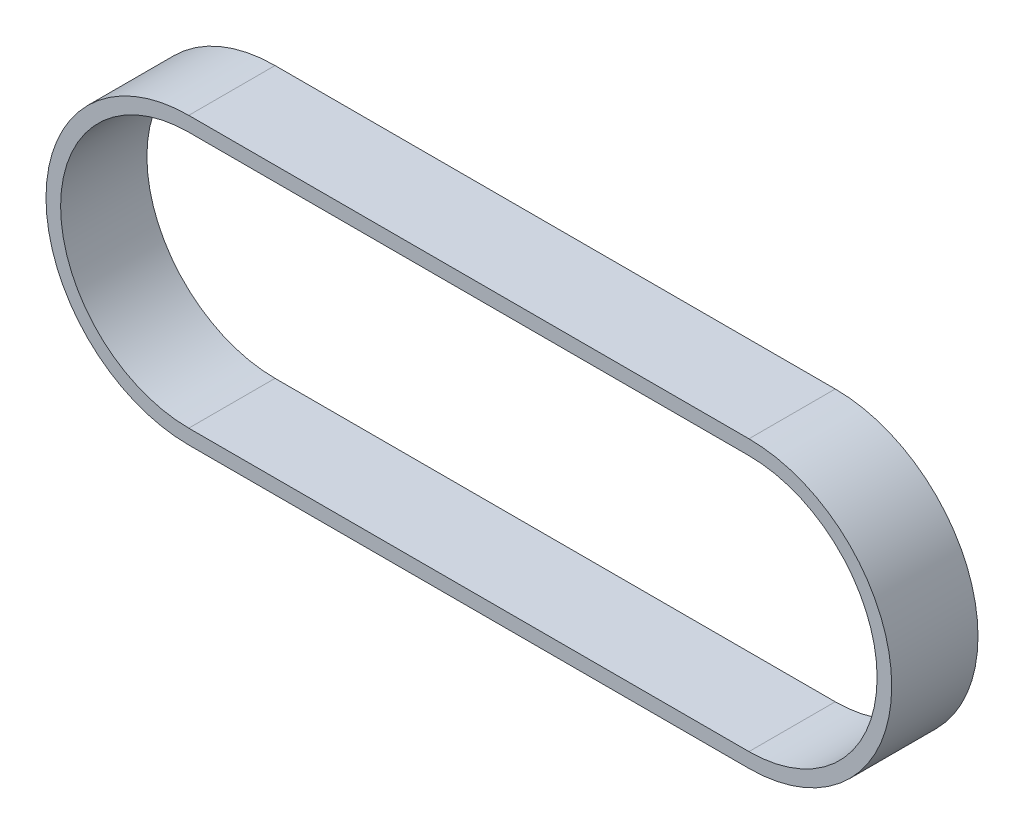
ISO-10303-21;
HEADER;
FILE_DESCRIPTION(('STEP AP214'),'2;1');
FILE_NAME('part.step','',(''),(''),'','','');
FILE_SCHEMA(('AUTOMOTIVE_DESIGN { 1 0 10303 214 1 1 1 1 }'));
ENDSEC;
DATA;
#1=APPLICATION_CONTEXT('core data for automotive mechanical design processes');
#2=APPLICATION_PROTOCOL_DEFINITION('international standard','automotive_design',2000,#1);
#3=PRODUCT_CONTEXT('',#1,'mechanical');
#4=PRODUCT('Part','Part','',(#3));
#5=PRODUCT_RELATED_PRODUCT_CATEGORY('part','',(#4));
#6=PRODUCT_DEFINITION_FORMATION('','',#4);
#7=PRODUCT_DEFINITION_CONTEXT('part definition',#1,'design');
#8=PRODUCT_DEFINITION('design','',#6,#7);
#9=PRODUCT_DEFINITION_SHAPE('','',#8);
#10=(LENGTH_UNIT() NAMED_UNIT(*) SI_UNIT(.MILLI.,.METRE.));
#11=(NAMED_UNIT(*) PLANE_ANGLE_UNIT() SI_UNIT($,.RADIAN.));
#12=(NAMED_UNIT(*) SI_UNIT($,.STERADIAN.) SOLID_ANGLE_UNIT());
#13=UNCERTAINTY_MEASURE_WITH_UNIT(LENGTH_MEASURE(1.E-05),#10,'distance_accuracy_value','');
#14=(GEOMETRIC_REPRESENTATION_CONTEXT(3) GLOBAL_UNCERTAINTY_ASSIGNED_CONTEXT((#13)) GLOBAL_UNIT_ASSIGNED_CONTEXT((#10,
#11,#12)) REPRESENTATION_CONTEXT('',''));
#15=CARTESIAN_POINT('',(0.,0.,0.));
#16=DIRECTION('',(0.,0.,1.));
#17=DIRECTION('',(1.,0.,0.));
#18=AXIS2_PLACEMENT_3D('',#15,#16,#17);
#19=CARTESIAN_POINT('',(0.,0.,15.));
#20=DIRECTION('',(0.,0.,-1.));
#21=DIRECTION('',(-1.,0.,0.));
#22=AXIS2_PLACEMENT_3D('',#19,#20,#21);
#23=PLANE('',#22);
#24=CARTESIAN_POINT('',(0.,0.,15.));
#25=DIRECTION('',(0.,0.,1.));
#26=DIRECTION('',(-1.,0.,0.));
#27=AXIS2_PLACEMENT_3D('',#24,#25,#26);
#28=CIRCLE('',#27,24.8158);
#29=CARTESIAN_POINT('',(0.,24.8158,15.));
#30=VERTEX_POINT('',#29);
#31=CARTESIAN_POINT('',(0.,-24.8158,15.));
#32=VERTEX_POINT('',#31);
#33=EDGE_CURVE('E142',#30,#32,#28,.T.);
#34=ORIENTED_EDGE('',*,*,#33,.T.);
#35=DIRECTION('',(1.,0.,0.));
#36=VECTOR('',#35,1.);
#37=CARTESIAN_POINT('',(97.3836,-24.8158,15.));
#38=LINE('',#37,#36);
#39=CARTESIAN_POINT('',(97.3836,-24.8158,15.));
#40=VERTEX_POINT('',#39);
#41=EDGE_CURVE('E145',#32,#40,#38,.T.);
#42=ORIENTED_EDGE('',*,*,#41,.T.);
#43=CARTESIAN_POINT('',(97.3836,0.,15.));
#44=DIRECTION('',(0.,0.,1.));
#45=DIRECTION('',(1.,0.,0.));
#46=AXIS2_PLACEMENT_3D('',#43,#44,#45);
#47=CIRCLE('',#46,24.8158);
#48=CARTESIAN_POINT('',(97.3836,24.8158,15.));
#49=VERTEX_POINT('',#48);
#50=EDGE_CURVE('E148',#40,#49,#47,.T.);
#51=ORIENTED_EDGE('',*,*,#50,.T.);
#52=DIRECTION('',(-1.,0.,0.));
#53=VECTOR('',#52,1.);
#54=CARTESIAN_POINT('',(0.,24.8158,15.));
#55=LINE('',#54,#53);
#56=EDGE_CURVE('E150',#49,#30,#55,.T.);
#57=ORIENTED_EDGE('',*,*,#56,.T.);
#58=EDGE_LOOP('',(#34,#42,#51,#57));
#59=FACE_BOUND('',#58,.T.);
#60=CARTESIAN_POINT('',(0.,0.,15.));
#61=DIRECTION('',(0.,0.,1.));
#62=DIRECTION('',(-1.,0.,0.));
#63=AXIS2_PLACEMENT_3D('',#60,#61,#62);
#64=CIRCLE('',#63,22.2758);
#65=CARTESIAN_POINT('',(0.,22.2758,15.));
#66=VERTEX_POINT('',#65);
#67=CARTESIAN_POINT('',(0.,-22.2758,15.));
#68=VERTEX_POINT('',#67);
#69=EDGE_CURVE('E106',#66,#68,#64,.T.);
#70=ORIENTED_EDGE('',*,*,#69,.F.);
#71=DIRECTION('',(-1.,0.,0.));
#72=VECTOR('',#71,1.);
#73=CARTESIAN_POINT('',(0.,22.2758,15.));
#74=LINE('',#73,#72);
#75=CARTESIAN_POINT('',(97.3836,22.2758,15.));
#76=VERTEX_POINT('',#75);
#77=EDGE_CURVE('E128',#76,#66,#74,.T.);
#78=ORIENTED_EDGE('',*,*,#77,.F.);
#79=CARTESIAN_POINT('',(97.3836,0.,15.));
#80=DIRECTION('',(0.,0.,1.));
#81=DIRECTION('',(1.,0.,0.));
#82=AXIS2_PLACEMENT_3D('',#79,#80,#81);
#83=CIRCLE('',#82,22.2758);
#84=CARTESIAN_POINT('',(97.3836,-22.2758,15.));
#85=VERTEX_POINT('',#84);
#86=EDGE_CURVE('E126',#85,#76,#83,.T.);
#87=ORIENTED_EDGE('',*,*,#86,.F.);
#88=DIRECTION('',(1.,0.,0.));
#89=VECTOR('',#88,1.);
#90=CARTESIAN_POINT('',(97.3836,-22.2758,15.));
#91=LINE('',#90,#89);
#92=EDGE_CURVE('E114',#68,#85,#91,.T.);
#93=ORIENTED_EDGE('',*,*,#92,.F.);
#94=EDGE_LOOP('',(#70,#78,#87,#93));
#95=FACE_BOUND('',#94,.T.);
#96=ADVANCED_FACE('F41',(#59,#95),#23,.F.);
#97=CARTESIAN_POINT('',(0.,0.,0.));
#98=DIRECTION('',(0.,0.,-1.));
#99=DIRECTION('',(-1.,0.,0.));
#100=AXIS2_PLACEMENT_3D('',#97,#98,#99);
#101=PLANE('',#100);
#102=CARTESIAN_POINT('',(0.,0.,0.));
#103=DIRECTION('',(0.,0.,1.));
#104=DIRECTION('',(-1.,0.,0.));
#105=AXIS2_PLACEMENT_3D('',#102,#103,#104);
#106=CIRCLE('',#105,24.8158);
#107=CARTESIAN_POINT('',(0.,24.8158,0.));
#108=VERTEX_POINT('',#107);
#109=CARTESIAN_POINT('',(0.,-24.8158,0.));
#110=VERTEX_POINT('',#109);
#111=EDGE_CURVE('E122',#108,#110,#106,.T.);
#112=ORIENTED_EDGE('',*,*,#111,.F.);
#113=DIRECTION('',(-1.,0.,0.));
#114=VECTOR('',#113,1.);
#115=CARTESIAN_POINT('',(0.,24.8158,0.));
#116=LINE('',#115,#114);
#117=CARTESIAN_POINT('',(97.3836,24.8158,0.));
#118=VERTEX_POINT('',#117);
#119=EDGE_CURVE('E146',#118,#108,#116,.T.);
#120=ORIENTED_EDGE('',*,*,#119,.F.);
#121=CARTESIAN_POINT('',(97.3836,0.,0.));
#122=DIRECTION('',(0.,0.,1.));
#123=DIRECTION('',(1.,0.,0.));
#124=AXIS2_PLACEMENT_3D('',#121,#122,#123);
#125=CIRCLE('',#124,24.8158);
#126=CARTESIAN_POINT('',(97.3836,-24.8158,0.));
#127=VERTEX_POINT('',#126);
#128=EDGE_CURVE('E157',#127,#118,#125,.T.);
#129=ORIENTED_EDGE('',*,*,#128,.F.);
#130=DIRECTION('',(1.,0.,0.));
#131=VECTOR('',#130,1.);
#132=CARTESIAN_POINT('',(97.3836,-24.8158,0.));
#133=LINE('',#132,#131);
#134=EDGE_CURVE('E155',#110,#127,#133,.T.);
#135=ORIENTED_EDGE('',*,*,#134,.F.);
#136=EDGE_LOOP('',(#112,#120,#129,#135));
#137=FACE_BOUND('',#136,.T.);
#138=DIRECTION('',(-1.,0.,0.));
#139=VECTOR('',#138,1.);
#140=CARTESIAN_POINT('',(0.,22.2758,0.));
#141=LINE('',#140,#139);
#142=CARTESIAN_POINT('',(97.3836,22.2758,0.));
#143=VERTEX_POINT('',#142);
#144=CARTESIAN_POINT('',(0.,22.2758,0.));
#145=VERTEX_POINT('',#144);
#146=EDGE_CURVE('E115',#143,#145,#141,.T.);
#147=ORIENTED_EDGE('',*,*,#146,.T.);
#148=CARTESIAN_POINT('',(0.,0.,0.));
#149=DIRECTION('',(0.,0.,1.));
#150=DIRECTION('',(-1.,0.,0.));
#151=AXIS2_PLACEMENT_3D('',#148,#149,#150);
#152=CIRCLE('',#151,22.2758);
#153=CARTESIAN_POINT('',(0.,-22.2758,0.));
#154=VERTEX_POINT('',#153);
#155=EDGE_CURVE('E64',#145,#154,#152,.T.);
#156=ORIENTED_EDGE('',*,*,#155,.T.);
#157=DIRECTION('',(1.,0.,0.));
#158=VECTOR('',#157,1.);
#159=CARTESIAN_POINT('',(97.3836,-22.2758,0.));
#160=LINE('',#159,#158);
#161=CARTESIAN_POINT('',(97.3836,-22.2758,0.));
#162=VERTEX_POINT('',#161);
#163=EDGE_CURVE('E121',#154,#162,#160,.T.);
#164=ORIENTED_EDGE('',*,*,#163,.T.);
#165=CARTESIAN_POINT('',(97.3836,0.,0.));
#166=DIRECTION('',(0.,0.,1.));
#167=DIRECTION('',(1.,0.,0.));
#168=AXIS2_PLACEMENT_3D('',#165,#166,#167);
#169=CIRCLE('',#168,22.2758);
#170=EDGE_CURVE('E134',#162,#143,#169,.T.);
#171=ORIENTED_EDGE('',*,*,#170,.T.);
#172=EDGE_LOOP('',(#147,#156,#164,#171));
#173=FACE_BOUND('',#172,.T.);
#174=ADVANCED_FACE('F175',(#137,#173),#101,.T.);
#175=CARTESIAN_POINT('',(0.,0.,15.));
#176=DIRECTION('',(0.,0.,-1.));
#177=DIRECTION('',(-1.,0.,0.));
#178=AXIS2_PLACEMENT_3D('',#175,#176,#177);
#179=CYLINDRICAL_SURFACE('',#178,24.8158);
#180=ORIENTED_EDGE('',*,*,#111,.T.);
#181=DIRECTION('',(0.,0.,-1.));
#182=VECTOR('',#181,1.);
#183=CARTESIAN_POINT('',(0.,-24.8158,15.));
#184=LINE('',#183,#182);
#185=EDGE_CURVE('E11',#32,#110,#184,.T.);
#186=ORIENTED_EDGE('',*,*,#185,.F.);
#187=ORIENTED_EDGE('',*,*,#33,.F.);
#188=DIRECTION('',(0.,0.,-1.));
#189=VECTOR('',#188,1.);
#190=CARTESIAN_POINT('',(0.,24.8158,15.));
#191=LINE('',#190,#189);
#192=EDGE_CURVE('E152',#30,#108,#191,.T.);
#193=ORIENTED_EDGE('',*,*,#192,.T.);
#194=EDGE_LOOP('',(#180,#186,#187,#193));
#195=FACE_BOUND('',#194,.T.);
#196=ADVANCED_FACE('F43',(#195),#179,.T.);
#197=CARTESIAN_POINT('',(97.3836,-24.8158,15.));
#198=DIRECTION('',(0.,1.,0.));
#199=DIRECTION('',(-1.,0.,0.));
#200=AXIS2_PLACEMENT_3D('',#197,#198,#199);
#201=PLANE('',#200);
#202=ORIENTED_EDGE('',*,*,#134,.T.);
#203=DIRECTION('',(0.,0.,-1.));
#204=VECTOR('',#203,1.);
#205=CARTESIAN_POINT('',(97.3836,-24.8158,15.));
#206=LINE('',#205,#204);
#207=EDGE_CURVE('E49',#40,#127,#206,.T.);
#208=ORIENTED_EDGE('',*,*,#207,.F.);
#209=ORIENTED_EDGE('',*,*,#41,.F.);
#210=ORIENTED_EDGE('',*,*,#185,.T.);
#211=EDGE_LOOP('',(#202,#208,#209,#210));
#212=FACE_BOUND('',#211,.T.);
#213=ADVANCED_FACE('F185',(#212),#201,.F.);
#214=CARTESIAN_POINT('',(97.3836,0.,15.));
#215=DIRECTION('',(0.,0.,-1.));
#216=DIRECTION('',(-1.,0.,0.));
#217=AXIS2_PLACEMENT_3D('',#214,#215,#216);
#218=CYLINDRICAL_SURFACE('',#217,24.8158);
#219=ORIENTED_EDGE('',*,*,#128,.T.);
#220=DIRECTION('',(0.,0.,-1.));
#221=VECTOR('',#220,1.);
#222=CARTESIAN_POINT('',(97.3836,24.8158,15.));
#223=LINE('',#222,#221);
#224=EDGE_CURVE('E162',#49,#118,#223,.T.);
#225=ORIENTED_EDGE('',*,*,#224,.F.);
#226=ORIENTED_EDGE('',*,*,#50,.F.);
#227=ORIENTED_EDGE('',*,*,#207,.T.);
#228=EDGE_LOOP('',(#219,#225,#226,#227));
#229=FACE_BOUND('',#228,.T.);
#230=ADVANCED_FACE('F169',(#229),#218,.T.);
#231=CARTESIAN_POINT('',(0.,24.8158,15.));
#232=DIRECTION('',(0.,-1.,0.));
#233=DIRECTION('',(1.,0.,0.));
#234=AXIS2_PLACEMENT_3D('',#231,#232,#233);
#235=PLANE('',#234);
#236=ORIENTED_EDGE('',*,*,#119,.T.);
#237=ORIENTED_EDGE('',*,*,#192,.F.);
#238=ORIENTED_EDGE('',*,*,#56,.F.);
#239=ORIENTED_EDGE('',*,*,#224,.T.);
#240=EDGE_LOOP('',(#236,#237,#238,#239));
#241=FACE_BOUND('',#240,.T.);
#242=ADVANCED_FACE('F179',(#241),#235,.F.);
#243=CARTESIAN_POINT('',(0.,0.,15.));
#244=DIRECTION('',(0.,0.,-1.));
#245=DIRECTION('',(-1.,0.,0.));
#246=AXIS2_PLACEMENT_3D('',#243,#244,#245);
#247=CYLINDRICAL_SURFACE('',#246,22.2758);
#248=ORIENTED_EDGE('',*,*,#155,.F.);
#249=DIRECTION('',(0.,0.,-1.));
#250=VECTOR('',#249,1.);
#251=CARTESIAN_POINT('',(0.,22.2758,15.));
#252=LINE('',#251,#250);
#253=EDGE_CURVE('E110',#66,#145,#252,.T.);
#254=ORIENTED_EDGE('',*,*,#253,.F.);
#255=ORIENTED_EDGE('',*,*,#69,.T.);
#256=DIRECTION('',(0.,0.,-1.));
#257=VECTOR('',#256,1.);
#258=CARTESIAN_POINT('',(0.,-22.2758,15.));
#259=LINE('',#258,#257);
#260=EDGE_CURVE('E109',#68,#154,#259,.T.);
#261=ORIENTED_EDGE('',*,*,#260,.T.);
#262=EDGE_LOOP('',(#248,#254,#255,#261));
#263=FACE_BOUND('',#262,.T.);
#264=ADVANCED_FACE('F108',(#263),#247,.F.);
#265=CARTESIAN_POINT('',(97.3836,-22.2758,15.));
#266=DIRECTION('',(0.,1.,0.));
#267=DIRECTION('',(-1.,0.,0.));
#268=AXIS2_PLACEMENT_3D('',#265,#266,#267);
#269=PLANE('',#268);
#270=ORIENTED_EDGE('',*,*,#163,.F.);
#271=ORIENTED_EDGE('',*,*,#260,.F.);
#272=ORIENTED_EDGE('',*,*,#92,.T.);
#273=DIRECTION('',(0.,0.,-1.));
#274=VECTOR('',#273,1.);
#275=CARTESIAN_POINT('',(97.3836,-22.2758,15.));
#276=LINE('',#275,#274);
#277=EDGE_CURVE('E123',#85,#162,#276,.T.);
#278=ORIENTED_EDGE('',*,*,#277,.T.);
#279=EDGE_LOOP('',(#270,#271,#272,#278));
#280=FACE_BOUND('',#279,.T.);
#281=ADVANCED_FACE('F118',(#280),#269,.T.);
#282=CARTESIAN_POINT('',(97.3836,0.,15.));
#283=DIRECTION('',(0.,0.,-1.));
#284=DIRECTION('',(-1.,0.,0.));
#285=AXIS2_PLACEMENT_3D('',#282,#283,#284);
#286=CYLINDRICAL_SURFACE('',#285,22.2758);
#287=ORIENTED_EDGE('',*,*,#170,.F.);
#288=ORIENTED_EDGE('',*,*,#277,.F.);
#289=ORIENTED_EDGE('',*,*,#86,.T.);
#290=DIRECTION('',(0.,0.,-1.));
#291=VECTOR('',#290,1.);
#292=CARTESIAN_POINT('',(97.3836,22.2758,15.));
#293=LINE('',#292,#291);
#294=EDGE_CURVE('E56',#76,#143,#293,.T.);
#295=ORIENTED_EDGE('',*,*,#294,.T.);
#296=EDGE_LOOP('',(#287,#288,#289,#295));
#297=FACE_BOUND('',#296,.T.);
#298=ADVANCED_FACE('F208',(#297),#286,.F.);
#299=CARTESIAN_POINT('',(0.,22.2758,15.));
#300=DIRECTION('',(0.,-1.,0.));
#301=DIRECTION('',(1.,0.,0.));
#302=AXIS2_PLACEMENT_3D('',#299,#300,#301);
#303=PLANE('',#302);
#304=ORIENTED_EDGE('',*,*,#146,.F.);
#305=ORIENTED_EDGE('',*,*,#294,.F.);
#306=ORIENTED_EDGE('',*,*,#77,.T.);
#307=ORIENTED_EDGE('',*,*,#253,.T.);
#308=EDGE_LOOP('',(#304,#305,#306,#307));
#309=FACE_BOUND('',#308,.T.);
#310=ADVANCED_FACE('F212',(#309),#303,.T.);
#311=CLOSED_SHELL('',(#96,#174,#196,#213,#230,#242,#264,#281,#298,#310));
#312=MANIFOLD_SOLID_BREP('B2',#311);
#313=ADVANCED_BREP_SHAPE_REPRESENTATION('',(#18,#312),#14);
#314=SHAPE_DEFINITION_REPRESENTATION(#9,#313);
ENDSEC;
END-ISO-10303-21;
